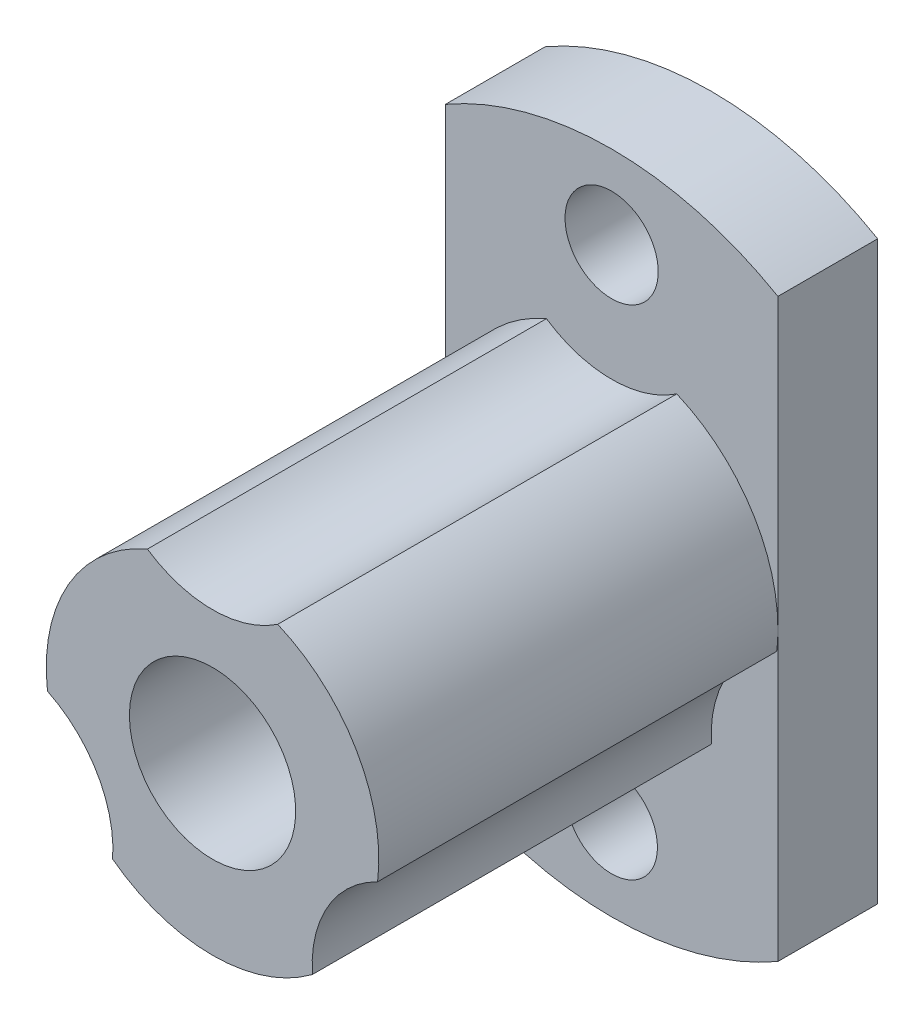
ISO-10303-21;
HEADER;
FILE_DESCRIPTION(('STEP AP214'),'2;1');
FILE_NAME('part.step','',(''),(''),'','','');
FILE_SCHEMA(('AUTOMOTIVE_DESIGN { 1 0 10303 214 1 1 1 1 }'));
ENDSEC;
DATA;
#1=APPLICATION_CONTEXT('core data for automotive mechanical design processes');
#2=APPLICATION_PROTOCOL_DEFINITION('international standard','automotive_design',2000,#1);
#3=PRODUCT_CONTEXT('',#1,'mechanical');
#4=PRODUCT('Part','Part','',(#3));
#5=PRODUCT_RELATED_PRODUCT_CATEGORY('part','',(#4));
#6=PRODUCT_DEFINITION_FORMATION('','',#4);
#7=PRODUCT_DEFINITION_CONTEXT('part definition',#1,'design');
#8=PRODUCT_DEFINITION('design','',#6,#7);
#9=PRODUCT_DEFINITION_SHAPE('','',#8);
#10=(LENGTH_UNIT() NAMED_UNIT(*) SI_UNIT(.MILLI.,.METRE.));
#11=(NAMED_UNIT(*) PLANE_ANGLE_UNIT() SI_UNIT($,.RADIAN.));
#12=(NAMED_UNIT(*) SI_UNIT($,.STERADIAN.) SOLID_ANGLE_UNIT());
#13=UNCERTAINTY_MEASURE_WITH_UNIT(LENGTH_MEASURE(1.E-05),#10,'distance_accuracy_value','');
#14=(GEOMETRIC_REPRESENTATION_CONTEXT(3) GLOBAL_UNCERTAINTY_ASSIGNED_CONTEXT((#13)) GLOBAL_UNIT_ASSIGNED_CONTEXT((#10,
#11,#12)) REPRESENTATION_CONTEXT('',''));
#15=CARTESIAN_POINT('',(0.,0.,0.));
#16=DIRECTION('',(0.,0.,1.));
#17=DIRECTION('',(1.,0.,0.));
#18=AXIS2_PLACEMENT_3D('',#15,#16,#17);
#19=CARTESIAN_POINT('',(8.24889197104676,-4.76250000000003,-8.76235856949767));
#20=DIRECTION('',(0.,0.,1.));
#21=DIRECTION('',(1.,0.,0.));
#22=AXIS2_PLACEMENT_3D('',#19,#20,#21);
#23=CYLINDRICAL_SURFACE('',#22,4.445);
#24=DIRECTION('',(0.,0.,-1.));
#25=VECTOR('',#24,1.);
#26=CARTESIAN_POINT('',(6.30366119824254,-0.765738530943423,19.05));
#27=LINE('',#26,#25);
#28=CARTESIAN_POINT('',(6.30366119824254,-0.765738530943425,19.05));
#29=VERTEX_POINT('',#28);
#30=CARTESIAN_POINT('',(6.30366119824254,-0.765738530943425,3.81000000000001));
#31=VERTEX_POINT('',#30);
#32=EDGE_CURVE('E145',#29,#31,#27,.T.);
#33=ORIENTED_EDGE('',*,*,#32,.F.);
#34=CARTESIAN_POINT('',(8.24889197104676,-4.76250000000003,19.05));
#35=DIRECTION('',(0.,0.,1.));
#36=DIRECTION('',(1.,0.,0.));
#37=AXIS2_PLACEMENT_3D('',#34,#35,#36);
#38=CIRCLE('',#37,4.445);
#39=CARTESIAN_POINT('',(3.81497961957482,-5.07626146905661,19.05));
#40=VERTEX_POINT('',#39);
#41=EDGE_CURVE('E141',#40,#29,#38,.F.);
#42=ORIENTED_EDGE('',*,*,#41,.F.);
#43=DIRECTION('',(0.,0.,-1.));
#44=VECTOR('',#43,1.);
#45=CARTESIAN_POINT('',(3.81497961957482,-5.07626146905661,19.05));
#46=LINE('',#45,#44);
#47=CARTESIAN_POINT('',(3.81497961957482,-5.07626146905661,3.81000000000001));
#48=VERTEX_POINT('',#47);
#49=EDGE_CURVE('E116',#48,#40,#46,.F.);
#50=ORIENTED_EDGE('',*,*,#49,.F.);
#51=CARTESIAN_POINT('',(8.24889197104676,-4.76250000000003,3.81000000000001));
#52=DIRECTION('',(0.,0.,1.));
#53=DIRECTION('',(1.,0.,0.));
#54=AXIS2_PLACEMENT_3D('',#51,#52,#53);
#55=CIRCLE('',#54,4.445);
#56=EDGE_CURVE('E122',#31,#48,#55,.T.);
#57=ORIENTED_EDGE('',*,*,#56,.F.);
#58=EDGE_LOOP('',(#33,#42,#50,#57));
#59=FACE_BOUND('',#58,.T.);
#60=ADVANCED_FACE('F17',(#59),#23,.F.);
#61=CARTESIAN_POINT('',(0.,0.,19.05));
#62=DIRECTION('',(0.,0.,-1.));
#63=DIRECTION('',(-1.,0.,0.));
#64=AXIS2_PLACEMENT_3D('',#61,#62,#63);
#65=CYLINDRICAL_SURFACE('',#64,6.35);
#66=CARTESIAN_POINT('',(0.,0.,3.81000000000001));
#67=DIRECTION('',(0.,0.,-1.));
#68=DIRECTION('',(-1.,0.,0.));
#69=AXIS2_PLACEMENT_3D('',#66,#67,#68);
#70=CIRCLE('',#69,6.35);
#71=CARTESIAN_POINT('',(-3.81497961957436,-5.07626146905696,3.81000000000001));
#72=VERTEX_POINT('',#71);
#73=EDGE_CURVE('E109',#48,#72,#70,.T.);
#74=ORIENTED_EDGE('',*,*,#73,.F.);
#75=ORIENTED_EDGE('',*,*,#49,.T.);
#76=CARTESIAN_POINT('',(0.,0.,19.05));
#77=DIRECTION('',(0.,0.,-1.));
#78=DIRECTION('',(-1.,0.,0.));
#79=AXIS2_PLACEMENT_3D('',#76,#77,#78);
#80=CIRCLE('',#79,6.35);
#81=CARTESIAN_POINT('',(-3.81497961957436,-5.07626146905696,19.05));
#82=VERTEX_POINT('',#81);
#83=EDGE_CURVE('E115',#82,#40,#80,.F.);
#84=ORIENTED_EDGE('',*,*,#83,.F.);
#85=DIRECTION('',(0.,0.,-1.));
#86=VECTOR('',#85,1.);
#87=CARTESIAN_POINT('',(-3.81497961957435,-5.07626146905696,19.05));
#88=LINE('',#87,#86);
#89=EDGE_CURVE('E102',#82,#72,#88,.T.);
#90=ORIENTED_EDGE('',*,*,#89,.T.);
#91=EDGE_LOOP('',(#74,#75,#84,#90));
#92=FACE_BOUND('',#91,.T.);
#93=ADVANCED_FACE('F113',(#92),#65,.T.);
#94=CARTESIAN_POINT('',(-8.24889197104659,-4.76250000000011,-8.76235856949767));
#95=DIRECTION('',(0.,0.,1.));
#96=DIRECTION('',(1.,0.,0.));
#97=AXIS2_PLACEMENT_3D('',#94,#95,#96);
#98=CYLINDRICAL_SURFACE('',#97,4.4450000000003);
#99=CARTESIAN_POINT('',(-8.24889197104659,-4.76250000000011,3.81000000000001));
#100=DIRECTION('',(0.,0.,1.));
#101=DIRECTION('',(1.,0.,0.));
#102=AXIS2_PLACEMENT_3D('',#99,#100,#101);
#103=CIRCLE('',#102,4.4450000000003);
#104=CARTESIAN_POINT('',(-6.30366119824259,-0.765738530943068,3.81));
#105=VERTEX_POINT('',#104);
#106=EDGE_CURVE('E98',#72,#105,#103,.T.);
#107=ORIENTED_EDGE('',*,*,#106,.F.);
#108=ORIENTED_EDGE('',*,*,#89,.F.);
#109=CARTESIAN_POINT('',(-8.24889197104659,-4.76250000000011,19.05));
#110=DIRECTION('',(0.,0.,1.));
#111=DIRECTION('',(1.,0.,0.));
#112=AXIS2_PLACEMENT_3D('',#109,#110,#111);
#113=CIRCLE('',#112,4.4450000000003);
#114=CARTESIAN_POINT('',(-6.30366119824259,-0.765738530943068,19.05));
#115=VERTEX_POINT('',#114);
#116=EDGE_CURVE('E130',#115,#82,#113,.F.);
#117=ORIENTED_EDGE('',*,*,#116,.F.);
#118=DIRECTION('',(0.,0.,1.));
#119=VECTOR('',#118,1.);
#120=CARTESIAN_POINT('',(-6.30366119824259,-0.765738530943068,-8.76235856949767));
#121=LINE('',#120,#119);
#122=EDGE_CURVE('E105',#105,#115,#121,.T.);
#123=ORIENTED_EDGE('',*,*,#122,.F.);
#124=EDGE_LOOP('',(#107,#108,#117,#123));
#125=FACE_BOUND('',#124,.T.);
#126=ADVANCED_FACE('F100',(#125),#98,.F.);
#127=CARTESIAN_POINT('',(0.,0.,19.05));
#128=DIRECTION('',(0.,0.,-1.));
#129=DIRECTION('',(-1.,0.,0.));
#130=AXIS2_PLACEMENT_3D('',#127,#128,#129);
#131=CYLINDRICAL_SURFACE('',#130,6.35);
#132=DIRECTION('',(0.,0.,1.));
#133=VECTOR('',#132,1.);
#134=CARTESIAN_POINT('',(-2.48868157866771,5.84200000000001,-8.76235856949767));
#135=LINE('',#134,#133);
#136=CARTESIAN_POINT('',(-2.4886815786677,5.84200000000001,19.05));
#137=VERTEX_POINT('',#136);
#138=CARTESIAN_POINT('',(-2.4886815786677,5.84200000000001,3.81000000000001));
#139=VERTEX_POINT('',#138);
#140=EDGE_CURVE('E151',#137,#139,#135,.F.);
#141=ORIENTED_EDGE('',*,*,#140,.T.);
#142=CARTESIAN_POINT('',(0.,0.,3.81000000000001));
#143=DIRECTION('',(0.,0.,-1.));
#144=DIRECTION('',(-1.,0.,0.));
#145=AXIS2_PLACEMENT_3D('',#142,#143,#144);
#146=CIRCLE('',#145,6.35);
#147=CARTESIAN_POINT('',(-6.35000000000001,0.,3.81));
#148=VERTEX_POINT('',#147);
#149=EDGE_CURVE('E108',#148,#139,#146,.T.);
#150=ORIENTED_EDGE('',*,*,#149,.F.);
#151=CARTESIAN_POINT('',(0.,0.,3.80999999999999));
#152=DIRECTION('',(0.,0.,-1.));
#153=DIRECTION('',(-1.,0.,0.));
#154=AXIS2_PLACEMENT_3D('',#151,#152,#153);
#155=CIRCLE('',#154,6.35);
#156=EDGE_CURVE('E20',#148,#105,#155,.F.);
#157=ORIENTED_EDGE('',*,*,#156,.T.);
#158=ORIENTED_EDGE('',*,*,#122,.T.);
#159=CARTESIAN_POINT('',(0.,0.,19.05));
#160=DIRECTION('',(0.,0.,-1.));
#161=DIRECTION('',(-1.,0.,0.));
#162=AXIS2_PLACEMENT_3D('',#159,#160,#161);
#163=CIRCLE('',#162,6.35);
#164=EDGE_CURVE('E133',#137,#115,#163,.F.);
#165=ORIENTED_EDGE('',*,*,#164,.F.);
#166=EDGE_LOOP('',(#141,#150,#157,#158,#165));
#167=FACE_BOUND('',#166,.T.);
#168=ADVANCED_FACE('F203',(#167),#131,.T.);
#169=CARTESIAN_POINT('',(0.,9.52500000000002,-8.76235856949767));
#170=DIRECTION('',(0.,0.,1.));
#171=DIRECTION('',(1.,0.,0.));
#172=AXIS2_PLACEMENT_3D('',#169,#170,#171);
#173=CYLINDRICAL_SURFACE('',#172,4.445);
#174=ORIENTED_EDGE('',*,*,#140,.F.);
#175=CARTESIAN_POINT('',(0.,9.52500000000002,19.05));
#176=DIRECTION('',(0.,0.,1.));
#177=DIRECTION('',(1.,0.,0.));
#178=AXIS2_PLACEMENT_3D('',#175,#176,#177);
#179=CIRCLE('',#178,4.445);
#180=CARTESIAN_POINT('',(2.4886815786677,5.842,19.05));
#181=VERTEX_POINT('',#180);
#182=EDGE_CURVE('E135',#181,#137,#179,.F.);
#183=ORIENTED_EDGE('',*,*,#182,.F.);
#184=DIRECTION('',(0.,0.,-1.));
#185=VECTOR('',#184,1.);
#186=CARTESIAN_POINT('',(2.4886815786677,5.842,19.05));
#187=LINE('',#186,#185);
#188=CARTESIAN_POINT('',(2.4886815786677,5.842,3.81000000000001));
#189=VERTEX_POINT('',#188);
#190=EDGE_CURVE('E142',#189,#181,#187,.F.);
#191=ORIENTED_EDGE('',*,*,#190,.F.);
#192=CARTESIAN_POINT('',(0.,9.52500000000002,3.81000000000001));
#193=DIRECTION('',(0.,0.,1.));
#194=DIRECTION('',(1.,0.,0.));
#195=AXIS2_PLACEMENT_3D('',#192,#193,#194);
#196=CIRCLE('',#195,4.445);
#197=EDGE_CURVE('E194',#139,#189,#196,.T.);
#198=ORIENTED_EDGE('',*,*,#197,.F.);
#199=EDGE_LOOP('',(#174,#183,#191,#198));
#200=FACE_BOUND('',#199,.T.);
#201=ADVANCED_FACE('F206',(#200),#173,.F.);
#202=CARTESIAN_POINT('',(0.,0.,19.05));
#203=DIRECTION('',(0.,0.,-1.));
#204=DIRECTION('',(-1.,0.,0.));
#205=AXIS2_PLACEMENT_3D('',#202,#203,#204);
#206=CYLINDRICAL_SURFACE('',#205,6.35);
#207=CARTESIAN_POINT('',(0.,0.,3.81000000000001));
#208=DIRECTION('',(0.,0.,-1.));
#209=DIRECTION('',(-1.,0.,0.));
#210=AXIS2_PLACEMENT_3D('',#207,#208,#209);
#211=CIRCLE('',#210,6.35);
#212=CARTESIAN_POINT('',(6.34999999999999,0.,3.81));
#213=VERTEX_POINT('',#212);
#214=EDGE_CURVE('E192',#189,#213,#211,.T.);
#215=ORIENTED_EDGE('',*,*,#214,.F.);
#216=ORIENTED_EDGE('',*,*,#190,.T.);
#217=CARTESIAN_POINT('',(0.,0.,19.05));
#218=DIRECTION('',(0.,0.,-1.));
#219=DIRECTION('',(-1.,0.,0.));
#220=AXIS2_PLACEMENT_3D('',#217,#218,#219);
#221=CIRCLE('',#220,6.35);
#222=EDGE_CURVE('E138',#29,#181,#221,.F.);
#223=ORIENTED_EDGE('',*,*,#222,.F.);
#224=ORIENTED_EDGE('',*,*,#32,.T.);
#225=CARTESIAN_POINT('',(0.,0.,3.81000000000001));
#226=DIRECTION('',(0.,0.,-1.));
#227=DIRECTION('',(-1.,0.,0.));
#228=AXIS2_PLACEMENT_3D('',#225,#226,#227);
#229=CIRCLE('',#228,6.35);
#230=EDGE_CURVE('E125',#213,#31,#229,.T.);
#231=ORIENTED_EDGE('',*,*,#230,.F.);
#232=EDGE_LOOP('',(#215,#216,#223,#224,#231));
#233=FACE_BOUND('',#232,.T.);
#234=ADVANCED_FACE('F208',(#233),#206,.T.);
#235=CARTESIAN_POINT('',(0.,0.,19.05));
#236=DIRECTION('',(0.,0.,1.));
#237=DIRECTION('',(1.,0.,0.));
#238=AXIS2_PLACEMENT_3D('',#235,#236,#237);
#239=PLANE('',#238);
#240=CARTESIAN_POINT('',(0.,0.,19.05));
#241=DIRECTION('',(0.,0.,-1.));
#242=DIRECTION('',(-1.,0.,0.));
#243=AXIS2_PLACEMENT_3D('',#240,#241,#242);
#244=CIRCLE('',#243,3.175);
#245=CARTESIAN_POINT('',(-3.175,0.,19.05));
#246=VERTEX_POINT('',#245);
#247=EDGE_CURVE('E183',#246,#246,#244,.T.);
#248=ORIENTED_EDGE('',*,*,#247,.T.);
#249=EDGE_LOOP('',(#248));
#250=FACE_BOUND('',#249,.T.);
#251=ORIENTED_EDGE('',*,*,#164,.T.);
#252=ORIENTED_EDGE('',*,*,#116,.T.);
#253=ORIENTED_EDGE('',*,*,#83,.T.);
#254=ORIENTED_EDGE('',*,*,#41,.T.);
#255=ORIENTED_EDGE('',*,*,#222,.T.);
#256=ORIENTED_EDGE('',*,*,#182,.T.);
#257=EDGE_LOOP('',(#251,#252,#253,#254,#255,#256));
#258=FACE_BOUND('',#257,.T.);
#259=ADVANCED_FACE('F242',(#250,#258),#239,.T.);
#260=CARTESIAN_POINT('',(0.,0.,3.80999999999999));
#261=DIRECTION('',(0.,0.,1.));
#262=DIRECTION('',(1.,0.,0.));
#263=AXIS2_PLACEMENT_3D('',#260,#261,#262);
#264=PLANE('',#263);
#265=ORIENTED_EDGE('',*,*,#73,.T.);
#266=ORIENTED_EDGE('',*,*,#106,.T.);
#267=ORIENTED_EDGE('',*,*,#156,.F.);
#268=DIRECTION('',(0.,-1.,0.));
#269=VECTOR('',#268,1.);
#270=CARTESIAN_POINT('',(-6.35000000000002,-17.9817708353668,3.80999999999999));
#271=LINE('',#270,#269);
#272=CARTESIAN_POINT('',(-6.35000000000002,-10.9985226280624,3.80999999999999));
#273=VERTEX_POINT('',#272);
#274=EDGE_CURVE('E222',#273,#148,#271,.F.);
#275=ORIENTED_EDGE('',*,*,#274,.F.);
#276=CARTESIAN_POINT('',(0.,0.,3.80999999999999));
#277=DIRECTION('',(0.,0.,-1.));
#278=DIRECTION('',(-1.,0.,0.));
#279=AXIS2_PLACEMENT_3D('',#276,#277,#278);
#280=CIRCLE('',#279,12.7);
#281=CARTESIAN_POINT('',(6.34999999999998,-10.9985226280624,3.81));
#282=VERTEX_POINT('',#281);
#283=EDGE_CURVE('E180',#282,#273,#280,.T.);
#284=ORIENTED_EDGE('',*,*,#283,.F.);
#285=DIRECTION('',(0.,1.,0.));
#286=VECTOR('',#285,1.);
#287=CARTESIAN_POINT('',(6.34999999999998,-17.9817708353668,3.81000000000001));
#288=LINE('',#287,#286);
#289=EDGE_CURVE('E155',#213,#282,#288,.F.);
#290=ORIENTED_EDGE('',*,*,#289,.F.);
#291=ORIENTED_EDGE('',*,*,#230,.T.);
#292=ORIENTED_EDGE('',*,*,#56,.T.);
#293=EDGE_LOOP('',(#265,#266,#267,#275,#284,#290,#291,#292));
#294=FACE_BOUND('',#293,.T.);
#295=CARTESIAN_POINT('',(0.,-9.52500000000001,3.81000000000001));
#296=DIRECTION('',(0.,0.,1.));
#297=DIRECTION('',(1.,0.,0.));
#298=AXIS2_PLACEMENT_3D('',#295,#296,#297);
#299=CIRCLE('',#298,1.74999999999999);
#300=CARTESIAN_POINT('',(1.74999999999999,-9.52500000000001,3.81000000000001));
#301=VERTEX_POINT('',#300);
#302=EDGE_CURVE('E189',#301,#301,#299,.F.);
#303=ORIENTED_EDGE('',*,*,#302,.T.);
#304=EDGE_LOOP('',(#303));
#305=FACE_BOUND('',#304,.T.);
#306=ADVANCED_FACE('F118',(#294,#305),#264,.T.);
#307=CARTESIAN_POINT('',(0.,0.,3.80999999999999));
#308=DIRECTION('',(0.,0.,1.));
#309=DIRECTION('',(1.,0.,0.));
#310=AXIS2_PLACEMENT_3D('',#307,#308,#309);
#311=PLANE('',#310);
#312=ORIENTED_EDGE('',*,*,#214,.T.);
#313=DIRECTION('',(0.,1.,0.));
#314=VECTOR('',#313,1.);
#315=CARTESIAN_POINT('',(6.34999999999998,-17.9817708353668,3.80999999999999));
#316=LINE('',#315,#314);
#317=CARTESIAN_POINT('',(6.34999999999998,10.9985226280624,3.80999999999999));
#318=VERTEX_POINT('',#317);
#319=EDGE_CURVE('E212',#318,#213,#316,.F.);
#320=ORIENTED_EDGE('',*,*,#319,.F.);
#321=CARTESIAN_POINT('',(0.,0.,3.80999999999999));
#322=DIRECTION('',(0.,0.,-1.));
#323=DIRECTION('',(-1.,0.,0.));
#324=AXIS2_PLACEMENT_3D('',#321,#322,#323);
#325=CIRCLE('',#324,12.7);
#326=CARTESIAN_POINT('',(-6.35000000000002,10.9985226280624,3.80999999999999));
#327=VERTEX_POINT('',#326);
#328=EDGE_CURVE('E177',#327,#318,#325,.T.);
#329=ORIENTED_EDGE('',*,*,#328,.F.);
#330=DIRECTION('',(0.,-1.,0.));
#331=VECTOR('',#330,1.);
#332=CARTESIAN_POINT('',(-6.35000000000002,-17.9817708353668,3.80999999999999));
#333=LINE('',#332,#331);
#334=EDGE_CURVE('E176',#148,#327,#333,.F.);
#335=ORIENTED_EDGE('',*,*,#334,.F.);
#336=ORIENTED_EDGE('',*,*,#149,.T.);
#337=ORIENTED_EDGE('',*,*,#197,.T.);
#338=EDGE_LOOP('',(#312,#320,#329,#335,#336,#337));
#339=FACE_BOUND('',#338,.T.);
#340=CARTESIAN_POINT('',(0.,9.52500000000002,3.80999999999999));
#341=DIRECTION('',(0.,0.,-1.));
#342=DIRECTION('',(-1.,0.,0.));
#343=AXIS2_PLACEMENT_3D('',#340,#341,#342);
#344=CIRCLE('',#343,1.78);
#345=CARTESIAN_POINT('',(-1.78,9.52500000000002,3.80999999999999));
#346=VERTEX_POINT('',#345);
#347=EDGE_CURVE('E186',#346,#346,#344,.T.);
#348=ORIENTED_EDGE('',*,*,#347,.T.);
#349=EDGE_LOOP('',(#348));
#350=FACE_BOUND('',#349,.T.);
#351=ADVANCED_FACE('F198',(#339,#350),#311,.T.);
#352=CARTESIAN_POINT('',(0.,-9.52500000000001,3.80999999999999));
#353=DIRECTION('',(0.,0.,1.));
#354=DIRECTION('',(1.,0.,0.));
#355=AXIS2_PLACEMENT_3D('',#352,#353,#354);
#356=CYLINDRICAL_SURFACE('',#355,1.74999999999999);
#357=CARTESIAN_POINT('',(0.,-9.52500000000001,0.));
#358=DIRECTION('',(0.,0.,1.));
#359=DIRECTION('',(1.,0.,0.));
#360=AXIS2_PLACEMENT_3D('',#357,#358,#359);
#361=CIRCLE('',#360,1.74999999999999);
#362=CARTESIAN_POINT('',(1.74999999999999,-9.52500000000001,0.));
#363=VERTEX_POINT('',#362);
#364=EDGE_CURVE('E173',#363,#363,#361,.F.);
#365=ORIENTED_EDGE('',*,*,#364,.T.);
#366=EDGE_LOOP('',(#365));
#367=FACE_BOUND('',#366,.T.);
#368=ORIENTED_EDGE('',*,*,#302,.F.);
#369=EDGE_LOOP('',(#368));
#370=FACE_BOUND('',#369,.T.);
#371=ADVANCED_FACE('F270',(#367,#370),#356,.F.);
#372=CARTESIAN_POINT('',(0.,9.52500000000002,0.));
#373=DIRECTION('',(0.,0.,-1.));
#374=DIRECTION('',(-1.,0.,0.));
#375=AXIS2_PLACEMENT_3D('',#372,#373,#374);
#376=CYLINDRICAL_SURFACE('',#375,1.78);
#377=ORIENTED_EDGE('',*,*,#347,.F.);
#378=EDGE_LOOP('',(#377));
#379=FACE_BOUND('',#378,.T.);
#380=CARTESIAN_POINT('',(0.,9.52500000000002,0.));
#381=DIRECTION('',(0.,0.,-1.));
#382=DIRECTION('',(-1.,0.,0.));
#383=AXIS2_PLACEMENT_3D('',#380,#381,#382);
#384=CIRCLE('',#383,1.78);
#385=CARTESIAN_POINT('',(-1.78,9.52500000000002,0.));
#386=VERTEX_POINT('',#385);
#387=EDGE_CURVE('E170',#386,#386,#384,.T.);
#388=ORIENTED_EDGE('',*,*,#387,.T.);
#389=EDGE_LOOP('',(#388));
#390=FACE_BOUND('',#389,.T.);
#391=ADVANCED_FACE('F266',(#379,#390),#376,.F.);
#392=CARTESIAN_POINT('',(0.,0.,19.051));
#393=DIRECTION('',(0.,0.,-1.));
#394=DIRECTION('',(-1.,0.,0.));
#395=AXIS2_PLACEMENT_3D('',#392,#393,#394);
#396=CYLINDRICAL_SURFACE('',#395,3.175);
#397=ORIENTED_EDGE('',*,*,#247,.F.);
#398=EDGE_LOOP('',(#397));
#399=FACE_BOUND('',#398,.T.);
#400=CARTESIAN_POINT('',(0.,0.,0.));
#401=DIRECTION('',(0.,0.,-1.));
#402=DIRECTION('',(-1.,0.,0.));
#403=AXIS2_PLACEMENT_3D('',#400,#401,#402);
#404=CIRCLE('',#403,3.175);
#405=CARTESIAN_POINT('',(-3.175,0.,0.));
#406=VERTEX_POINT('',#405);
#407=EDGE_CURVE('E167',#406,#406,#404,.T.);
#408=ORIENTED_EDGE('',*,*,#407,.T.);
#409=EDGE_LOOP('',(#408));
#410=FACE_BOUND('',#409,.T.);
#411=ADVANCED_FACE('F263',(#399,#410),#396,.F.);
#412=CARTESIAN_POINT('',(0.,0.,3.80999999999999));
#413=DIRECTION('',(0.,0.,-1.));
#414=DIRECTION('',(-1.,0.,0.));
#415=AXIS2_PLACEMENT_3D('',#412,#413,#414);
#416=CYLINDRICAL_SURFACE('',#415,12.7);
#417=DIRECTION('',(0.,0.,1.));
#418=VECTOR('',#417,1.);
#419=CARTESIAN_POINT('',(6.34999999999998,-10.9985226280624,-11.43));
#420=LINE('',#419,#418);
#421=CARTESIAN_POINT('',(6.34999999999999,-10.9985226280624,0.));
#422=VERTEX_POINT('',#421);
#423=EDGE_CURVE('E182',#282,#422,#420,.F.);
#424=ORIENTED_EDGE('',*,*,#423,.F.);
#425=ORIENTED_EDGE('',*,*,#283,.T.);
#426=DIRECTION('',(0.,0.,1.));
#427=VECTOR('',#426,1.);
#428=CARTESIAN_POINT('',(-6.35000000000002,-10.9985226280624,-11.43));
#429=LINE('',#428,#427);
#430=CARTESIAN_POINT('',(-6.35000000000002,-10.9985226280624,0.));
#431=VERTEX_POINT('',#430);
#432=EDGE_CURVE('E224',#431,#273,#429,.T.);
#433=ORIENTED_EDGE('',*,*,#432,.F.);
#434=CARTESIAN_POINT('',(0.,0.,0.));
#435=DIRECTION('',(0.,0.,-1.));
#436=DIRECTION('',(-1.,0.,0.));
#437=AXIS2_PLACEMENT_3D('',#434,#435,#436);
#438=CIRCLE('',#437,12.7);
#439=EDGE_CURVE('E164',#431,#422,#438,.F.);
#440=ORIENTED_EDGE('',*,*,#439,.T.);
#441=EDGE_LOOP('',(#424,#425,#433,#440));
#442=FACE_BOUND('',#441,.T.);
#443=ADVANCED_FACE('F237',(#442),#416,.T.);
#444=CARTESIAN_POINT('',(6.34999999999998,-17.9817708353668,-11.43));
#445=DIRECTION('',(1.,0.,0.));
#446=DIRECTION('',(0.,1.,0.));
#447=AXIS2_PLACEMENT_3D('',#444,#445,#446);
#448=PLANE('',#447);
#449=ORIENTED_EDGE('',*,*,#319,.T.);
#450=ORIENTED_EDGE('',*,*,#289,.T.);
#451=ORIENTED_EDGE('',*,*,#423,.T.);
#452=DIRECTION('',(0.,1.,0.));
#453=VECTOR('',#452,1.);
#454=CARTESIAN_POINT('',(6.34999999999999,0.,0.));
#455=LINE('',#454,#453);
#456=CARTESIAN_POINT('',(6.34999999999999,10.9985226280624,0.));
#457=VERTEX_POINT('',#456);
#458=EDGE_CURVE('E163',#422,#457,#455,.T.);
#459=ORIENTED_EDGE('',*,*,#458,.T.);
#460=DIRECTION('',(0.,0.,-1.));
#461=VECTOR('',#460,1.);
#462=CARTESIAN_POINT('',(6.34999999999998,10.9985226280624,3.80999999999999));
#463=LINE('',#462,#461);
#464=EDGE_CURVE('E179',#318,#457,#463,.T.);
#465=ORIENTED_EDGE('',*,*,#464,.F.);
#466=EDGE_LOOP('',(#449,#450,#451,#459,#465));
#467=FACE_BOUND('',#466,.T.);
#468=ADVANCED_FACE('F216',(#467),#448,.T.);
#469=CARTESIAN_POINT('',(0.,0.,3.80999999999999));
#470=DIRECTION('',(0.,0.,-1.));
#471=DIRECTION('',(-1.,0.,0.));
#472=AXIS2_PLACEMENT_3D('',#469,#470,#471);
#473=CYLINDRICAL_SURFACE('',#472,12.7);
#474=ORIENTED_EDGE('',*,*,#464,.T.);
#475=CARTESIAN_POINT('',(0.,0.,0.));
#476=DIRECTION('',(0.,0.,-1.));
#477=DIRECTION('',(-1.,0.,0.));
#478=AXIS2_PLACEMENT_3D('',#475,#476,#477);
#479=CIRCLE('',#478,12.7);
#480=CARTESIAN_POINT('',(-6.35000000000002,10.9985226280624,0.));
#481=VERTEX_POINT('',#480);
#482=EDGE_CURVE('E26',#457,#481,#479,.F.);
#483=ORIENTED_EDGE('',*,*,#482,.T.);
#484=DIRECTION('',(0.,0.,1.));
#485=VECTOR('',#484,1.);
#486=CARTESIAN_POINT('',(-6.35000000000002,10.9985226280624,-11.43));
#487=LINE('',#486,#485);
#488=EDGE_CURVE('E34',#327,#481,#487,.F.);
#489=ORIENTED_EDGE('',*,*,#488,.F.);
#490=ORIENTED_EDGE('',*,*,#328,.T.);
#491=EDGE_LOOP('',(#474,#483,#489,#490));
#492=FACE_BOUND('',#491,.T.);
#493=ADVANCED_FACE('F241',(#492),#473,.T.);
#494=CARTESIAN_POINT('',(-6.35000000000002,-17.9817708353668,-11.43));
#495=DIRECTION('',(-1.,0.,0.));
#496=DIRECTION('',(0.,-1.,0.));
#497=AXIS2_PLACEMENT_3D('',#494,#495,#496);
#498=PLANE('',#497);
#499=ORIENTED_EDGE('',*,*,#274,.T.);
#500=ORIENTED_EDGE('',*,*,#334,.T.);
#501=ORIENTED_EDGE('',*,*,#488,.T.);
#502=DIRECTION('',(0.,1.,0.));
#503=VECTOR('',#502,1.);
#504=CARTESIAN_POINT('',(-6.35000000000002,0.,0.));
#505=LINE('',#504,#503);
#506=EDGE_CURVE('E11',#481,#431,#505,.F.);
#507=ORIENTED_EDGE('',*,*,#506,.T.);
#508=ORIENTED_EDGE('',*,*,#432,.T.);
#509=EDGE_LOOP('',(#499,#500,#501,#507,#508));
#510=FACE_BOUND('',#509,.T.);
#511=ADVANCED_FACE('F239',(#510),#498,.T.);
#512=CARTESIAN_POINT('',(0.,0.,0.));
#513=DIRECTION('',(0.,0.,1.));
#514=DIRECTION('',(1.,0.,0.));
#515=AXIS2_PLACEMENT_3D('',#512,#513,#514);
#516=PLANE('',#515);
#517=ORIENTED_EDGE('',*,*,#482,.F.);
#518=ORIENTED_EDGE('',*,*,#458,.F.);
#519=ORIENTED_EDGE('',*,*,#439,.F.);
#520=ORIENTED_EDGE('',*,*,#506,.F.);
#521=EDGE_LOOP('',(#517,#518,#519,#520));
#522=FACE_BOUND('',#521,.T.);
#523=ORIENTED_EDGE('',*,*,#407,.F.);
#524=EDGE_LOOP('',(#523));
#525=FACE_BOUND('',#524,.T.);
#526=ORIENTED_EDGE('',*,*,#387,.F.);
#527=EDGE_LOOP('',(#526));
#528=FACE_BOUND('',#527,.T.);
#529=ORIENTED_EDGE('',*,*,#364,.F.);
#530=EDGE_LOOP('',(#529));
#531=FACE_BOUND('',#530,.T.);
#532=ADVANCED_FACE('F233',(#522,#525,#528,#531),#516,.F.);
#533=CLOSED_SHELL('',(#60,#93,#126,#168,#201,#234,#259,#306,#351,#371,#391,#411,#443,#468,#493,
#511,#532));
#534=MANIFOLD_SOLID_BREP('B1',#533);
#535=ADVANCED_BREP_SHAPE_REPRESENTATION('',(#18,#534),#14);
#536=SHAPE_DEFINITION_REPRESENTATION(#9,#535);
ENDSEC;
END-ISO-10303-21;
